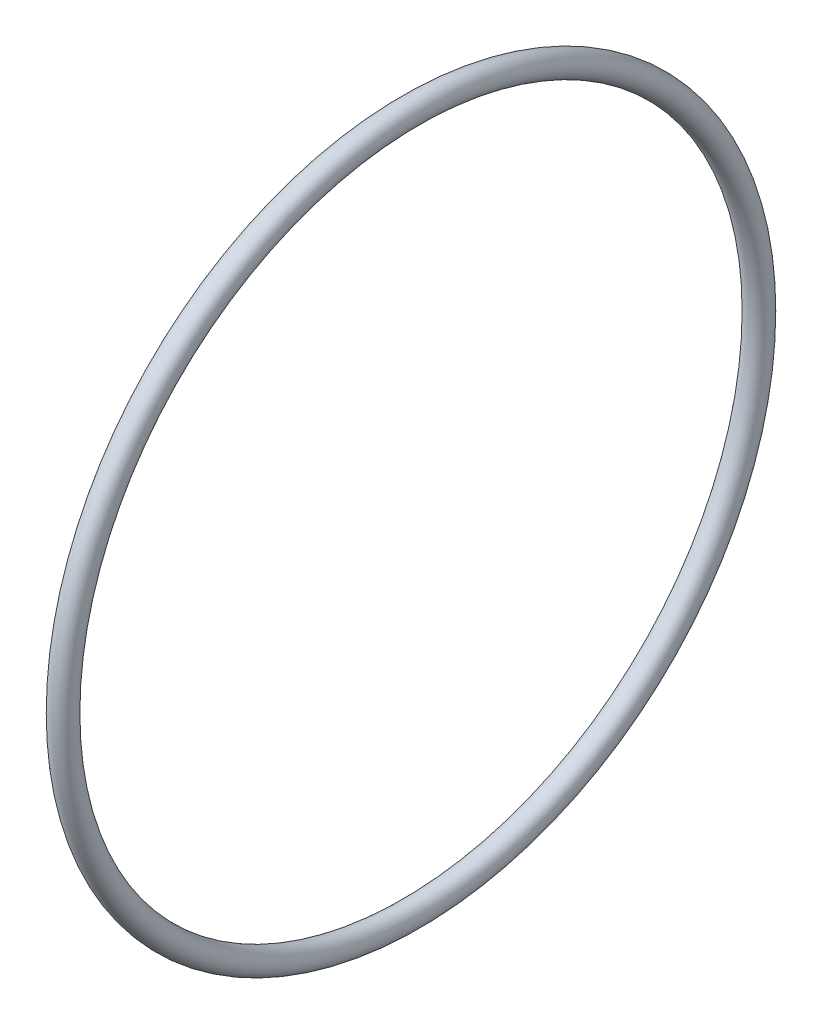
ISO-10303-21;
HEADER;
FILE_DESCRIPTION(('STEP AP214'),'2;1');
FILE_NAME('part.step','',(''),(''),'','','');
FILE_SCHEMA(('AUTOMOTIVE_DESIGN { 1 0 10303 214 1 1 1 1 }'));
ENDSEC;
DATA;
#1=APPLICATION_CONTEXT('core data for automotive mechanical design processes');
#2=APPLICATION_PROTOCOL_DEFINITION('international standard','automotive_design',2000,#1);
#3=PRODUCT_CONTEXT('',#1,'mechanical');
#4=PRODUCT('Part','Part','',(#3));
#5=PRODUCT_RELATED_PRODUCT_CATEGORY('part','',(#4));
#6=PRODUCT_DEFINITION_FORMATION('','',#4);
#7=PRODUCT_DEFINITION_CONTEXT('part definition',#1,'design');
#8=PRODUCT_DEFINITION('design','',#6,#7);
#9=PRODUCT_DEFINITION_SHAPE('','',#8);
#10=(LENGTH_UNIT() NAMED_UNIT(*) SI_UNIT(.MILLI.,.METRE.));
#11=(NAMED_UNIT(*) PLANE_ANGLE_UNIT() SI_UNIT($,.RADIAN.));
#12=(NAMED_UNIT(*) SI_UNIT($,.STERADIAN.) SOLID_ANGLE_UNIT());
#13=UNCERTAINTY_MEASURE_WITH_UNIT(LENGTH_MEASURE(1.E-05),#10,'distance_accuracy_value','');
#14=(GEOMETRIC_REPRESENTATION_CONTEXT(3) GLOBAL_UNCERTAINTY_ASSIGNED_CONTEXT((#13)) GLOBAL_UNIT_ASSIGNED_CONTEXT((#10,
#11,#12)) REPRESENTATION_CONTEXT('',''));
#15=CARTESIAN_POINT('',(0.,0.,0.));
#16=DIRECTION('',(0.,0.,1.));
#17=DIRECTION('',(1.,0.,0.));
#18=AXIS2_PLACEMENT_3D('',#15,#16,#17);
#19=CARTESIAN_POINT('',(0.,0.,0.));
#20=DIRECTION('',(-1.,0.,0.));
#21=DIRECTION('',(0.,0.,1.));
#22=AXIS2_PLACEMENT_3D('',#19,#20,#21);
#23=TOROIDAL_SURFACE('',#22,19.,0.65);
#24=CARTESIAN_POINT('',(0.,0.,19.65));
#25=VERTEX_POINT('',#24);
#26=VERTEX_LOOP('',#25);
#27=FACE_BOUND('',#26,.T.);
#28=ADVANCED_FACE('F33',(#27),#23,.T.);
#29=CLOSED_SHELL('',(#28));
#30=MANIFOLD_SOLID_BREP('B2',#29);
#31=ADVANCED_BREP_SHAPE_REPRESENTATION('',(#18,#30),#14);
#32=SHAPE_DEFINITION_REPRESENTATION(#9,#31);
ENDSEC;
END-ISO-10303-21;
